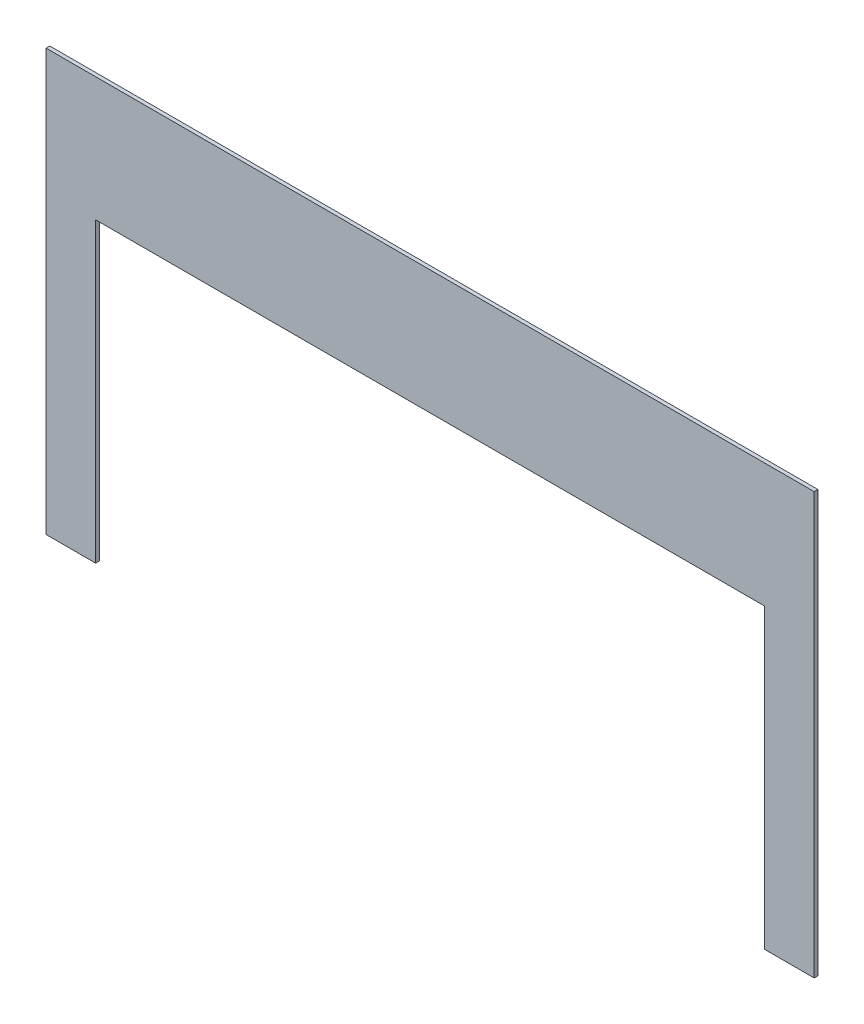
ISO-10303-21;
HEADER;
FILE_DESCRIPTION(('STEP AP214'),'2;1');
FILE_NAME('part.step','',(''),(''),'','','');
FILE_SCHEMA(('AUTOMOTIVE_DESIGN { 1 0 10303 214 1 1 1 1 }'));
ENDSEC;
DATA;
#1=APPLICATION_CONTEXT('core data for automotive mechanical design processes');
#2=APPLICATION_PROTOCOL_DEFINITION('international standard','automotive_design',2000,#1);
#3=PRODUCT_CONTEXT('',#1,'mechanical');
#4=PRODUCT('Part','Part','',(#3));
#5=PRODUCT_RELATED_PRODUCT_CATEGORY('part','',(#4));
#6=PRODUCT_DEFINITION_FORMATION('','',#4);
#7=PRODUCT_DEFINITION_CONTEXT('part definition',#1,'design');
#8=PRODUCT_DEFINITION('design','',#6,#7);
#9=PRODUCT_DEFINITION_SHAPE('','',#8);
#10=(LENGTH_UNIT() NAMED_UNIT(*) SI_UNIT(.MILLI.,.METRE.));
#11=(NAMED_UNIT(*) PLANE_ANGLE_UNIT() SI_UNIT($,.RADIAN.));
#12=(NAMED_UNIT(*) SI_UNIT($,.STERADIAN.) SOLID_ANGLE_UNIT());
#13=UNCERTAINTY_MEASURE_WITH_UNIT(LENGTH_MEASURE(1.E-05),#10,'distance_accuracy_value','');
#14=(GEOMETRIC_REPRESENTATION_CONTEXT(3) GLOBAL_UNCERTAINTY_ASSIGNED_CONTEXT((#13)) GLOBAL_UNIT_ASSIGNED_CONTEXT((#10,
#11,#12)) REPRESENTATION_CONTEXT('',''));
#15=CARTESIAN_POINT('',(0.,0.,0.));
#16=DIRECTION('',(0.,0.,1.));
#17=DIRECTION('',(1.,0.,0.));
#18=AXIS2_PLACEMENT_3D('',#15,#16,#17);
#19=CARTESIAN_POINT('',(30.,1780.,40.));
#20=DIRECTION('',(0.,1.,0.));
#21=DIRECTION('',(0.,0.,1.));
#22=AXIS2_PLACEMENT_3D('',#19,#20,#21);
#23=PLANE('',#22);
#24=DIRECTION('',(0.,0.,-1.));
#25=VECTOR('',#24,1.);
#26=CARTESIAN_POINT('',(50.,1780.,40.));
#27=LINE('',#26,#25);
#28=CARTESIAN_POINT('',(50.,1780.,40.));
#29=VERTEX_POINT('',#28);
#30=CARTESIAN_POINT('',(50.,1780.,38.5));
#31=VERTEX_POINT('',#30);
#32=EDGE_CURVE('E129',#29,#31,#27,.T.);
#33=ORIENTED_EDGE('',*,*,#32,.F.);
#34=DIRECTION('',(1.,0.,0.));
#35=VECTOR('',#34,1.);
#36=CARTESIAN_POINT('',(30.,1780.,40.));
#37=LINE('',#36,#35);
#38=CARTESIAN_POINT('',(30.,1780.,40.));
#39=VERTEX_POINT('',#38);
#40=EDGE_CURVE('E92',#39,#29,#37,.T.);
#41=ORIENTED_EDGE('',*,*,#40,.F.);
#42=DIRECTION('',(0.,0.,-1.));
#43=VECTOR('',#42,1.);
#44=CARTESIAN_POINT('',(30.,1780.,40.));
#45=LINE('',#44,#43);
#46=CARTESIAN_POINT('',(30.,1780.,38.5));
#47=VERTEX_POINT('',#46);
#48=EDGE_CURVE('E158',#39,#47,#45,.T.);
#49=ORIENTED_EDGE('',*,*,#48,.T.);
#50=DIRECTION('',(1.,0.,0.));
#51=VECTOR('',#50,1.);
#52=CARTESIAN_POINT('',(30.,1780.,38.5));
#53=LINE('',#52,#51);
#54=EDGE_CURVE('E146',#47,#31,#53,.T.);
#55=ORIENTED_EDGE('',*,*,#54,.T.);
#56=EDGE_LOOP('',(#33,#41,#49,#55));
#57=FACE_BOUND('',#56,.T.);
#58=ADVANCED_FACE('F39',(#57),#23,.F.);
#59=DIRECTION('',(0.,0.,1.));
#60=VECTOR('',#59,1.);
#61=CARTESIAN_POINT('',(320.,1780.,40.));
#62=LINE('',#61,#60);
#63=CARTESIAN_POINT('',(320.,1780.,38.5));
#64=VERTEX_POINT('',#63);
#65=CARTESIAN_POINT('',(320.,1780.,40.));
#66=VERTEX_POINT('',#65);
#67=EDGE_CURVE('E120',#64,#66,#62,.T.);
#68=ORIENTED_EDGE('',*,*,#67,.F.);
#69=CARTESIAN_POINT('',(340.,1780.,38.5));
#70=VERTEX_POINT('',#69);
#71=EDGE_CURVE('E132',#64,#70,#53,.T.);
#72=ORIENTED_EDGE('',*,*,#71,.T.);
#73=DIRECTION('',(0.,0.,-1.));
#74=VECTOR('',#73,1.);
#75=CARTESIAN_POINT('',(340.,1780.,40.));
#76=LINE('',#75,#74);
#77=CARTESIAN_POINT('',(340.,1780.,40.));
#78=VERTEX_POINT('',#77);
#79=EDGE_CURVE('E155',#78,#70,#76,.T.);
#80=ORIENTED_EDGE('',*,*,#79,.F.);
#81=EDGE_CURVE('E140',#66,#78,#37,.T.);
#82=ORIENTED_EDGE('',*,*,#81,.F.);
#83=EDGE_LOOP('',(#68,#72,#80,#82));
#84=FACE_BOUND('',#83,.T.);
#85=ADVANCED_FACE('F171',(#84),#23,.F.);
#86=CARTESIAN_POINT('',(0.,0.,40.));
#87=DIRECTION('',(0.,0.,-1.));
#88=DIRECTION('',(-1.,0.,0.));
#89=AXIS2_PLACEMENT_3D('',#86,#87,#88);
#90=PLANE('',#89);
#91=DIRECTION('',(0.,-1.,0.));
#92=VECTOR('',#91,1.);
#93=CARTESIAN_POINT('',(50.,0.,40.));
#94=LINE('',#93,#92);
#95=CARTESIAN_POINT('',(50.,1900.,40.));
#96=VERTEX_POINT('',#95);
#97=EDGE_CURVE('E124',#96,#29,#94,.T.);
#98=ORIENTED_EDGE('',*,*,#97,.F.);
#99=DIRECTION('',(-1.,0.,0.));
#100=VECTOR('',#99,1.);
#101=CARTESIAN_POINT('',(0.,1900.,40.));
#102=LINE('',#101,#100);
#103=CARTESIAN_POINT('',(320.,1900.,40.));
#104=VERTEX_POINT('',#103);
#105=EDGE_CURVE('E114',#104,#96,#102,.T.);
#106=ORIENTED_EDGE('',*,*,#105,.F.);
#107=DIRECTION('',(0.,1.,0.));
#108=VECTOR('',#107,1.);
#109=CARTESIAN_POINT('',(320.,0.,40.));
#110=LINE('',#109,#108);
#111=EDGE_CURVE('E134',#66,#104,#110,.T.);
#112=ORIENTED_EDGE('',*,*,#111,.F.);
#113=ORIENTED_EDGE('',*,*,#81,.T.);
#114=DIRECTION('',(0.,1.,0.));
#115=VECTOR('',#114,1.);
#116=CARTESIAN_POINT('',(340.,1780.,40.));
#117=LINE('',#116,#115);
#118=CARTESIAN_POINT('',(340.,1950.,40.));
#119=VERTEX_POINT('',#118);
#120=EDGE_CURVE('E142',#78,#119,#117,.T.);
#121=ORIENTED_EDGE('',*,*,#120,.T.);
#122=DIRECTION('',(-1.,0.,0.));
#123=VECTOR('',#122,1.);
#124=CARTESIAN_POINT('',(30.,1950.,40.));
#125=LINE('',#124,#123);
#126=CARTESIAN_POINT('',(30.,1950.,40.));
#127=VERTEX_POINT('',#126);
#128=EDGE_CURVE('E63',#119,#127,#125,.T.);
#129=ORIENTED_EDGE('',*,*,#128,.T.);
#130=DIRECTION('',(0.,-1.,0.));
#131=VECTOR('',#130,1.);
#132=CARTESIAN_POINT('',(30.,1780.,40.));
#133=LINE('',#132,#131);
#134=EDGE_CURVE('E138',#127,#39,#133,.T.);
#135=ORIENTED_EDGE('',*,*,#134,.T.);
#136=ORIENTED_EDGE('',*,*,#40,.T.);
#137=EDGE_LOOP('',(#98,#106,#112,#113,#121,#129,#135,#136));
#138=FACE_BOUND('',#137,.T.);
#139=ADVANCED_FACE('F127',(#138),#90,.F.);
#140=CARTESIAN_POINT('',(0.,0.,38.5));
#141=DIRECTION('',(0.,0.,-1.));
#142=DIRECTION('',(-1.,0.,0.));
#143=AXIS2_PLACEMENT_3D('',#140,#141,#142);
#144=PLANE('',#143);
#145=DIRECTION('',(-1.,0.,0.));
#146=VECTOR('',#145,1.);
#147=CARTESIAN_POINT('',(0.,1900.,38.5));
#148=LINE('',#147,#146);
#149=CARTESIAN_POINT('',(320.,1900.,38.5));
#150=VERTEX_POINT('',#149);
#151=CARTESIAN_POINT('',(50.,1900.,38.5));
#152=VERTEX_POINT('',#151);
#153=EDGE_CURVE('E160',#150,#152,#148,.T.);
#154=ORIENTED_EDGE('',*,*,#153,.T.);
#155=DIRECTION('',(0.,-1.,0.));
#156=VECTOR('',#155,1.);
#157=CARTESIAN_POINT('',(50.,0.,38.5));
#158=LINE('',#157,#156);
#159=EDGE_CURVE('E11',#152,#31,#158,.T.);
#160=ORIENTED_EDGE('',*,*,#159,.T.);
#161=ORIENTED_EDGE('',*,*,#54,.F.);
#162=DIRECTION('',(0.,-1.,0.));
#163=VECTOR('',#162,1.);
#164=CARTESIAN_POINT('',(30.,1780.,38.5));
#165=LINE('',#164,#163);
#166=CARTESIAN_POINT('',(30.,1950.,38.5));
#167=VERTEX_POINT('',#166);
#168=EDGE_CURVE('E128',#167,#47,#165,.T.);
#169=ORIENTED_EDGE('',*,*,#168,.F.);
#170=DIRECTION('',(-1.,0.,0.));
#171=VECTOR('',#170,1.);
#172=CARTESIAN_POINT('',(30.,1950.,38.5));
#173=LINE('',#172,#171);
#174=CARTESIAN_POINT('',(340.,1950.,38.5));
#175=VERTEX_POINT('',#174);
#176=EDGE_CURVE('E84',#175,#167,#173,.T.);
#177=ORIENTED_EDGE('',*,*,#176,.F.);
#178=DIRECTION('',(0.,1.,0.));
#179=VECTOR('',#178,1.);
#180=CARTESIAN_POINT('',(340.,1780.,38.5));
#181=LINE('',#180,#179);
#182=EDGE_CURVE('E149',#70,#175,#181,.T.);
#183=ORIENTED_EDGE('',*,*,#182,.F.);
#184=ORIENTED_EDGE('',*,*,#71,.F.);
#185=DIRECTION('',(0.,1.,0.));
#186=VECTOR('',#185,1.);
#187=CARTESIAN_POINT('',(320.,0.,38.5));
#188=LINE('',#187,#186);
#189=EDGE_CURVE('E47',#64,#150,#188,.T.);
#190=ORIENTED_EDGE('',*,*,#189,.T.);
#191=EDGE_LOOP('',(#154,#160,#161,#169,#177,#183,#184,#190));
#192=FACE_BOUND('',#191,.T.);
#193=ADVANCED_FACE('F164',(#192),#144,.T.);
#194=CARTESIAN_POINT('',(30.,1780.,40.));
#195=DIRECTION('',(1.,0.,0.));
#196=DIRECTION('',(0.,0.,-1.));
#197=AXIS2_PLACEMENT_3D('',#194,#195,#196);
#198=PLANE('',#197);
#199=ORIENTED_EDGE('',*,*,#168,.T.);
#200=ORIENTED_EDGE('',*,*,#48,.F.);
#201=ORIENTED_EDGE('',*,*,#134,.F.);
#202=DIRECTION('',(0.,0.,-1.));
#203=VECTOR('',#202,1.);
#204=CARTESIAN_POINT('',(30.,1950.,40.));
#205=LINE('',#204,#203);
#206=EDGE_CURVE('E144',#127,#167,#205,.T.);
#207=ORIENTED_EDGE('',*,*,#206,.T.);
#208=EDGE_LOOP('',(#199,#200,#201,#207));
#209=FACE_BOUND('',#208,.T.);
#210=ADVANCED_FACE('F41',(#209),#198,.F.);
#211=CARTESIAN_POINT('',(340.,1780.,40.));
#212=DIRECTION('',(-1.,0.,0.));
#213=DIRECTION('',(0.,0.,1.));
#214=AXIS2_PLACEMENT_3D('',#211,#212,#213);
#215=PLANE('',#214);
#216=ORIENTED_EDGE('',*,*,#182,.T.);
#217=DIRECTION('',(0.,0.,-1.));
#218=VECTOR('',#217,1.);
#219=CARTESIAN_POINT('',(340.,1950.,40.));
#220=LINE('',#219,#218);
#221=EDGE_CURVE('E153',#119,#175,#220,.T.);
#222=ORIENTED_EDGE('',*,*,#221,.F.);
#223=ORIENTED_EDGE('',*,*,#120,.F.);
#224=ORIENTED_EDGE('',*,*,#79,.T.);
#225=EDGE_LOOP('',(#216,#222,#223,#224));
#226=FACE_BOUND('',#225,.T.);
#227=ADVANCED_FACE('F178',(#226),#215,.F.);
#228=CARTESIAN_POINT('',(30.,1950.,40.));
#229=DIRECTION('',(0.,-1.,0.));
#230=DIRECTION('',(0.,0.,-1.));
#231=AXIS2_PLACEMENT_3D('',#228,#229,#230);
#232=PLANE('',#231);
#233=ORIENTED_EDGE('',*,*,#176,.T.);
#234=ORIENTED_EDGE('',*,*,#206,.F.);
#235=ORIENTED_EDGE('',*,*,#128,.F.);
#236=ORIENTED_EDGE('',*,*,#221,.T.);
#237=EDGE_LOOP('',(#233,#234,#235,#236));
#238=FACE_BOUND('',#237,.T.);
#239=ADVANCED_FACE('F179',(#238),#232,.F.);
#240=CARTESIAN_POINT('',(50.,1760.,41.));
#241=DIRECTION('',(1.,0.,0.));
#242=DIRECTION('',(0.,0.,-1.));
#243=AXIS2_PLACEMENT_3D('',#240,#241,#242);
#244=PLANE('',#243);
#245=ORIENTED_EDGE('',*,*,#97,.T.);
#246=ORIENTED_EDGE('',*,*,#32,.T.);
#247=ORIENTED_EDGE('',*,*,#159,.F.);
#248=DIRECTION('',(0.,0.,-1.));
#249=VECTOR('',#248,1.);
#250=CARTESIAN_POINT('',(50.,1900.,41.));
#251=LINE('',#250,#249);
#252=EDGE_CURVE('E54',#96,#152,#251,.T.);
#253=ORIENTED_EDGE('',*,*,#252,.F.);
#254=EDGE_LOOP('',(#245,#246,#247,#253));
#255=FACE_BOUND('',#254,.T.);
#256=ADVANCED_FACE('F123',(#255),#244,.T.);
#257=CARTESIAN_POINT('',(320.,1760.,41.));
#258=DIRECTION('',(-1.,0.,0.));
#259=DIRECTION('',(0.,0.,1.));
#260=AXIS2_PLACEMENT_3D('',#257,#258,#259);
#261=PLANE('',#260);
#262=ORIENTED_EDGE('',*,*,#111,.T.);
#263=DIRECTION('',(0.,0.,-1.));
#264=VECTOR('',#263,1.);
#265=CARTESIAN_POINT('',(320.,1900.,41.));
#266=LINE('',#265,#264);
#267=EDGE_CURVE('E117',#104,#150,#266,.T.);
#268=ORIENTED_EDGE('',*,*,#267,.T.);
#269=ORIENTED_EDGE('',*,*,#189,.F.);
#270=ORIENTED_EDGE('',*,*,#67,.T.);
#271=EDGE_LOOP('',(#262,#268,#269,#270));
#272=FACE_BOUND('',#271,.T.);
#273=ADVANCED_FACE('F168',(#272),#261,.T.);
#274=CARTESIAN_POINT('',(50.,1900.,41.));
#275=DIRECTION('',(0.,-1.,0.));
#276=DIRECTION('',(0.,0.,-1.));
#277=AXIS2_PLACEMENT_3D('',#274,#275,#276);
#278=PLANE('',#277);
#279=ORIENTED_EDGE('',*,*,#105,.T.);
#280=ORIENTED_EDGE('',*,*,#252,.T.);
#281=ORIENTED_EDGE('',*,*,#153,.F.);
#282=ORIENTED_EDGE('',*,*,#267,.F.);
#283=EDGE_LOOP('',(#279,#280,#281,#282));
#284=FACE_BOUND('',#283,.T.);
#285=ADVANCED_FACE('F115',(#284),#278,.T.);
#286=CLOSED_SHELL('',(#58,#85,#139,#193,#210,#227,#239,#256,#273,#285));
#287=MANIFOLD_SOLID_BREP('B2',#286);
#288=ADVANCED_BREP_SHAPE_REPRESENTATION('',(#18,#287),#14);
#289=SHAPE_DEFINITION_REPRESENTATION(#9,#288);
ENDSEC;
END-ISO-10303-21;
